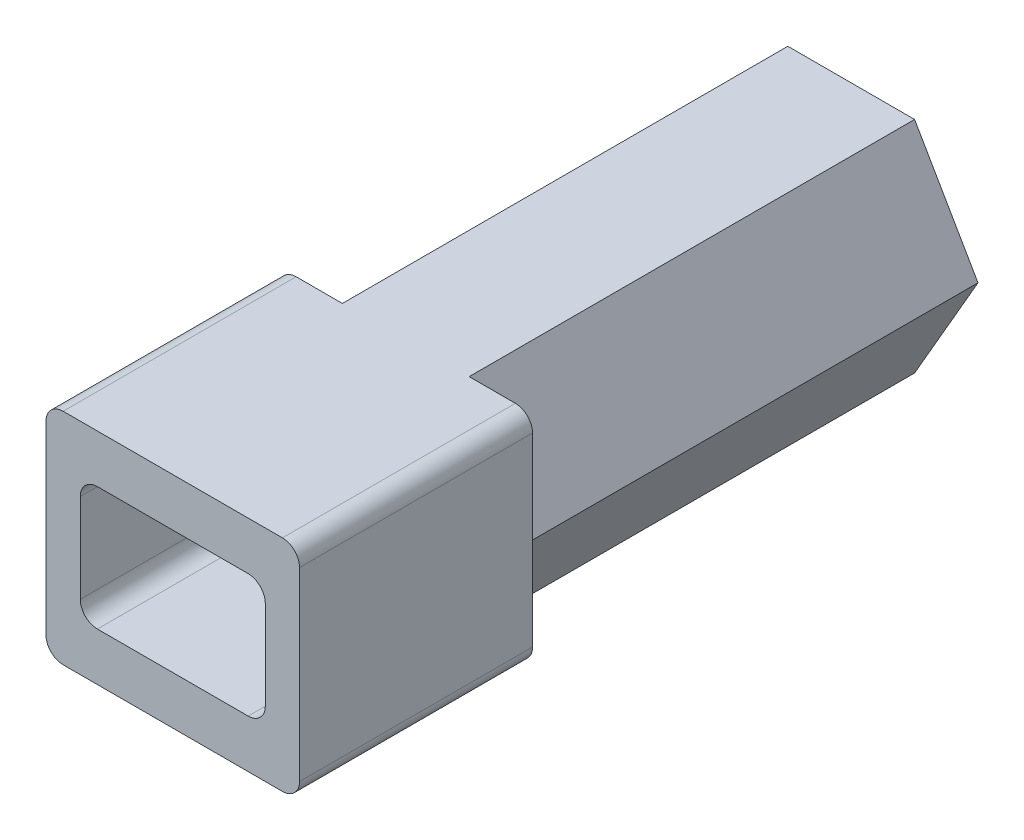
ISO-10303-21;
HEADER;
FILE_DESCRIPTION(('STEP AP214'),'2;1');
FILE_NAME('part.step','',(''),(''),'','','');
FILE_SCHEMA(('AUTOMOTIVE_DESIGN { 1 0 10303 214 1 1 1 1 }'));
ENDSEC;
DATA;
#1=APPLICATION_CONTEXT('core data for automotive mechanical design processes');
#2=APPLICATION_PROTOCOL_DEFINITION('international standard','automotive_design',2000,#1);
#3=PRODUCT_CONTEXT('',#1,'mechanical');
#4=PRODUCT('Part','Part','',(#3));
#5=PRODUCT_RELATED_PRODUCT_CATEGORY('part','',(#4));
#6=PRODUCT_DEFINITION_FORMATION('','',#4);
#7=PRODUCT_DEFINITION_CONTEXT('part definition',#1,'design');
#8=PRODUCT_DEFINITION('design','',#6,#7);
#9=PRODUCT_DEFINITION_SHAPE('','',#8);
#10=(LENGTH_UNIT() NAMED_UNIT(*) SI_UNIT(.MILLI.,.METRE.));
#11=(NAMED_UNIT(*) PLANE_ANGLE_UNIT() SI_UNIT($,.RADIAN.));
#12=(NAMED_UNIT(*) SI_UNIT($,.STERADIAN.) SOLID_ANGLE_UNIT());
#13=UNCERTAINTY_MEASURE_WITH_UNIT(LENGTH_MEASURE(1.E-05),#10,'distance_accuracy_value','');
#14=(GEOMETRIC_REPRESENTATION_CONTEXT(3) GLOBAL_UNCERTAINTY_ASSIGNED_CONTEXT((#13)) GLOBAL_UNIT_ASSIGNED_CONTEXT((#10,
#11,#12)) REPRESENTATION_CONTEXT('',''));
#15=CARTESIAN_POINT('',(0.,0.,0.));
#16=DIRECTION('',(0.,0.,1.));
#17=DIRECTION('',(1.,0.,0.));
#18=AXIS2_PLACEMENT_3D('',#15,#16,#17);
#19=CARTESIAN_POINT('',(1.85,-3.20429399400242,13.));
#20=DIRECTION('',(-0.866025403784439,0.5,0.));
#21=DIRECTION('',(-0.5,-0.866025403784439,0.));
#22=AXIS2_PLACEMENT_3D('',#19,#20,#21);
#23=PLANE('',#22);
#24=DIRECTION('',(0.5,0.866025403784439,0.));
#25=VECTOR('',#24,1.);
#26=CARTESIAN_POINT('',(1.85,-3.20429399400242,0.));
#27=LINE('',#26,#25);
#28=CARTESIAN_POINT('',(1.85,-3.20429399400242,0.));
#29=VERTEX_POINT('',#28);
#30=CARTESIAN_POINT('',(3.7,0.,0.));
#31=VERTEX_POINT('',#30);
#32=EDGE_CURVE('E186',#29,#31,#27,.T.);
#33=ORIENTED_EDGE('',*,*,#32,.T.);
#34=DIRECTION('',(0.,0.,-1.));
#35=VECTOR('',#34,1.);
#36=CARTESIAN_POINT('',(3.7,0.,13.));
#37=LINE('',#36,#35);
#38=CARTESIAN_POINT('',(3.7,0.,13.));
#39=VERTEX_POINT('',#38);
#40=EDGE_CURVE('E11',#39,#31,#37,.T.);
#41=ORIENTED_EDGE('',*,*,#40,.F.);
#42=DIRECTION('',(0.5,0.866025403784439,0.));
#43=VECTOR('',#42,1.);
#44=CARTESIAN_POINT('',(1.85,-3.20429399400242,13.));
#45=LINE('',#44,#43);
#46=CARTESIAN_POINT('',(1.85,-3.20429399400242,13.));
#47=VERTEX_POINT('',#46);
#48=EDGE_CURVE('E187',#47,#39,#45,.T.);
#49=ORIENTED_EDGE('',*,*,#48,.F.);
#50=DIRECTION('',(0.,0.,-1.));
#51=VECTOR('',#50,1.);
#52=CARTESIAN_POINT('',(1.85,-3.20429399400242,13.));
#53=LINE('',#52,#51);
#54=EDGE_CURVE('E68',#47,#29,#53,.T.);
#55=ORIENTED_EDGE('',*,*,#54,.T.);
#56=EDGE_LOOP('',(#33,#41,#49,#55));
#57=FACE_BOUND('',#56,.T.);
#58=ADVANCED_FACE('F43',(#57),#23,.F.);
#59=CARTESIAN_POINT('',(3.7,0.,13.));
#60=DIRECTION('',(-0.866025403784438,-0.5,0.));
#61=DIRECTION('',(0.5,-0.866025403784439,0.));
#62=AXIS2_PLACEMENT_3D('',#59,#60,#61);
#63=PLANE('',#62);
#64=DIRECTION('',(-0.5,0.866025403784438,0.));
#65=VECTOR('',#64,1.);
#66=CARTESIAN_POINT('',(3.7,0.,0.));
#67=LINE('',#66,#65);
#68=CARTESIAN_POINT('',(1.85,3.20429399400242,0.));
#69=VERTEX_POINT('',#68);
#70=EDGE_CURVE('E199',#31,#69,#67,.T.);
#71=ORIENTED_EDGE('',*,*,#70,.T.);
#72=DIRECTION('',(0.,0.,-1.));
#73=VECTOR('',#72,1.);
#74=CARTESIAN_POINT('',(1.85,3.20429399400242,13.));
#75=LINE('',#74,#73);
#76=CARTESIAN_POINT('',(1.85,3.20429399400242,13.));
#77=VERTEX_POINT('',#76);
#78=EDGE_CURVE('E52',#77,#69,#75,.T.);
#79=ORIENTED_EDGE('',*,*,#78,.F.);
#80=DIRECTION('',(-0.5,0.866025403784438,0.));
#81=VECTOR('',#80,1.);
#82=CARTESIAN_POINT('',(3.7,0.,13.));
#83=LINE('',#82,#81);
#84=EDGE_CURVE('E101',#39,#77,#83,.T.);
#85=ORIENTED_EDGE('',*,*,#84,.F.);
#86=ORIENTED_EDGE('',*,*,#40,.T.);
#87=EDGE_LOOP('',(#71,#79,#85,#86));
#88=FACE_BOUND('',#87,.T.);
#89=ADVANCED_FACE('F542',(#88),#63,.F.);
#90=CARTESIAN_POINT('',(1.85,3.20429399400242,13.));
#91=DIRECTION('',(0.,-1.,0.));
#92=DIRECTION('',(0.,0.,-1.));
#93=AXIS2_PLACEMENT_3D('',#90,#91,#92);
#94=PLANE('',#93);
#95=DIRECTION('',(-1.,0.,0.));
#96=VECTOR('',#95,1.);
#97=CARTESIAN_POINT('',(1.85,3.20429399400242,0.));
#98=LINE('',#97,#96);
#99=CARTESIAN_POINT('',(-1.85,3.20429399400242,0.));
#100=VERTEX_POINT('',#99);
#101=EDGE_CURVE('E120',#69,#100,#98,.T.);
#102=ORIENTED_EDGE('',*,*,#101,.T.);
#103=DIRECTION('',(0.,0.,-1.));
#104=VECTOR('',#103,1.);
#105=CARTESIAN_POINT('',(-1.85,3.20429399400242,13.));
#106=LINE('',#105,#104);
#107=CARTESIAN_POINT('',(-1.85,3.20429399400242,13.));
#108=VERTEX_POINT('',#107);
#109=EDGE_CURVE('E110',#108,#100,#106,.T.);
#110=ORIENTED_EDGE('',*,*,#109,.F.);
#111=DIRECTION('',(-1.,0.,0.));
#112=VECTOR('',#111,1.);
#113=CARTESIAN_POINT('',(1.85,3.20429399400242,13.));
#114=LINE('',#113,#112);
#115=CARTESIAN_POINT('',(-3.2,3.20429399400242,13.));
#116=VERTEX_POINT('',#115);
#117=EDGE_CURVE('E116',#108,#116,#114,.T.);
#118=ORIENTED_EDGE('',*,*,#117,.T.);
#119=DIRECTION('',(0.,0.,-1.));
#120=VECTOR('',#119,1.);
#121=CARTESIAN_POINT('',(-3.2,3.20429399400242,19.8));
#122=LINE('',#121,#120);
#123=CARTESIAN_POINT('',(-3.2,3.20429399400242,19.8));
#124=VERTEX_POINT('',#123);
#125=EDGE_CURVE('E183',#124,#116,#122,.T.);
#126=ORIENTED_EDGE('',*,*,#125,.F.);
#127=DIRECTION('',(-1.,0.,0.));
#128=VECTOR('',#127,1.);
#129=CARTESIAN_POINT('',(1.85,3.20429399400242,19.8));
#130=LINE('',#129,#128);
#131=CARTESIAN_POINT('',(3.19999999999999,3.20429399400242,19.8));
#132=VERTEX_POINT('',#131);
#133=EDGE_CURVE('E148',#132,#124,#130,.T.);
#134=ORIENTED_EDGE('',*,*,#133,.F.);
#135=DIRECTION('',(0.,0.,-1.));
#136=VECTOR('',#135,1.);
#137=CARTESIAN_POINT('',(3.19999999999999,3.20429399400242,19.8));
#138=LINE('',#137,#136);
#139=CARTESIAN_POINT('',(3.19999999999999,3.20429399400242,13.));
#140=VERTEX_POINT('',#139);
#141=EDGE_CURVE('E154',#132,#140,#138,.T.);
#142=ORIENTED_EDGE('',*,*,#141,.T.);
#143=EDGE_CURVE('E142',#140,#77,#114,.T.);
#144=ORIENTED_EDGE('',*,*,#143,.T.);
#145=ORIENTED_EDGE('',*,*,#78,.T.);
#146=EDGE_LOOP('',(#102,#110,#118,#126,#134,#142,#144,#145));
#147=FACE_BOUND('',#146,.T.);
#148=ADVANCED_FACE('F112',(#147),#94,.F.);
#149=CARTESIAN_POINT('',(-1.85,3.20429399400242,13.));
#150=DIRECTION('',(0.866025403784439,-0.5,0.));
#151=DIRECTION('',(0.5,0.866025403784439,0.));
#152=AXIS2_PLACEMENT_3D('',#149,#150,#151);
#153=PLANE('',#152);
#154=DIRECTION('',(-0.5,-0.866025403784439,0.));
#155=VECTOR('',#154,1.);
#156=CARTESIAN_POINT('',(-1.85,3.20429399400242,0.));
#157=LINE('',#156,#155);
#158=CARTESIAN_POINT('',(-3.7,0.,0.));
#159=VERTEX_POINT('',#158);
#160=EDGE_CURVE('E204',#100,#159,#157,.T.);
#161=ORIENTED_EDGE('',*,*,#160,.T.);
#162=DIRECTION('',(0.,0.,-1.));
#163=VECTOR('',#162,1.);
#164=CARTESIAN_POINT('',(-3.7,0.,13.));
#165=LINE('',#164,#163);
#166=CARTESIAN_POINT('',(-3.7,0.,13.));
#167=VERTEX_POINT('',#166);
#168=EDGE_CURVE('E124',#167,#159,#165,.T.);
#169=ORIENTED_EDGE('',*,*,#168,.F.);
#170=DIRECTION('',(-0.5,-0.866025403784439,0.));
#171=VECTOR('',#170,1.);
#172=CARTESIAN_POINT('',(-1.85,3.20429399400242,13.));
#173=LINE('',#172,#171);
#174=EDGE_CURVE('E127',#108,#167,#173,.T.);
#175=ORIENTED_EDGE('',*,*,#174,.F.);
#176=ORIENTED_EDGE('',*,*,#109,.T.);
#177=EDGE_LOOP('',(#161,#169,#175,#176));
#178=FACE_BOUND('',#177,.T.);
#179=ADVANCED_FACE('F128',(#178),#153,.F.);
#180=CARTESIAN_POINT('',(-3.7,0.,13.));
#181=DIRECTION('',(0.866025403784439,0.5,0.));
#182=DIRECTION('',(-0.5,0.866025403784439,0.));
#183=AXIS2_PLACEMENT_3D('',#180,#181,#182);
#184=PLANE('',#183);
#185=DIRECTION('',(0.5,-0.866025403784439,0.));
#186=VECTOR('',#185,1.);
#187=CARTESIAN_POINT('',(-3.7,0.,0.));
#188=LINE('',#187,#186);
#189=CARTESIAN_POINT('',(-1.85,-3.20429399400242,0.));
#190=VERTEX_POINT('',#189);
#191=EDGE_CURVE('E207',#159,#190,#188,.T.);
#192=ORIENTED_EDGE('',*,*,#191,.T.);
#193=DIRECTION('',(0.,0.,-1.));
#194=VECTOR('',#193,1.);
#195=CARTESIAN_POINT('',(-1.85,-3.20429399400242,13.));
#196=LINE('',#195,#194);
#197=CARTESIAN_POINT('',(-1.85,-3.20429399400243,13.));
#198=VERTEX_POINT('',#197);
#199=EDGE_CURVE('E214',#198,#190,#196,.T.);
#200=ORIENTED_EDGE('',*,*,#199,.F.);
#201=DIRECTION('',(0.5,-0.866025403784439,0.));
#202=VECTOR('',#201,1.);
#203=CARTESIAN_POINT('',(-3.7,0.,13.));
#204=LINE('',#203,#202);
#205=EDGE_CURVE('E135',#167,#198,#204,.T.);
#206=ORIENTED_EDGE('',*,*,#205,.F.);
#207=ORIENTED_EDGE('',*,*,#168,.T.);
#208=EDGE_LOOP('',(#192,#200,#206,#207));
#209=FACE_BOUND('',#208,.T.);
#210=ADVANCED_FACE('F226',(#209),#184,.F.);
#211=CARTESIAN_POINT('',(-1.85,-3.20429399400242,13.));
#212=DIRECTION('',(0.,1.,0.));
#213=DIRECTION('',(-1.,0.,0.));
#214=AXIS2_PLACEMENT_3D('',#211,#212,#213);
#215=PLANE('',#214);
#216=DIRECTION('',(1.,0.,0.));
#217=VECTOR('',#216,1.);
#218=CARTESIAN_POINT('',(-1.85,-3.20429399400242,0.));
#219=LINE('',#218,#217);
#220=EDGE_CURVE('E94',#190,#29,#219,.T.);
#221=ORIENTED_EDGE('',*,*,#220,.T.);
#222=ORIENTED_EDGE('',*,*,#54,.F.);
#223=DIRECTION('',(1.,0.,0.));
#224=VECTOR('',#223,1.);
#225=CARTESIAN_POINT('',(1.85,-3.20429399400242,13.));
#226=LINE('',#225,#224);
#227=CARTESIAN_POINT('',(3.19999999999999,-3.20429399400242,13.));
#228=VERTEX_POINT('',#227);
#229=EDGE_CURVE('E245',#47,#228,#226,.T.);
#230=ORIENTED_EDGE('',*,*,#229,.T.);
#231=DIRECTION('',(0.,0.,-1.));
#232=VECTOR('',#231,1.);
#233=CARTESIAN_POINT('',(3.19999999999999,-3.20429399400242,19.8));
#234=LINE('',#233,#232);
#235=CARTESIAN_POINT('',(3.19999999999999,-3.20429399400242,19.8));
#236=VERTEX_POINT('',#235);
#237=EDGE_CURVE('E167',#236,#228,#234,.T.);
#238=ORIENTED_EDGE('',*,*,#237,.F.);
#239=DIRECTION('',(1.,0.,0.));
#240=VECTOR('',#239,1.);
#241=CARTESIAN_POINT('',(-1.85,-3.20429399400242,19.8));
#242=LINE('',#241,#240);
#243=CARTESIAN_POINT('',(-3.2,-3.20429399400242,19.8));
#244=VERTEX_POINT('',#243);
#245=EDGE_CURVE('E323',#244,#236,#242,.T.);
#246=ORIENTED_EDGE('',*,*,#245,.F.);
#247=DIRECTION('',(0.,0.,-1.));
#248=VECTOR('',#247,1.);
#249=CARTESIAN_POINT('',(-3.2,-3.20429399400242,19.8));
#250=LINE('',#249,#248);
#251=CARTESIAN_POINT('',(-3.2,-3.20429399400242,13.));
#252=VERTEX_POINT('',#251);
#253=EDGE_CURVE('E171',#244,#252,#250,.T.);
#254=ORIENTED_EDGE('',*,*,#253,.T.);
#255=EDGE_CURVE('E234',#252,#198,#226,.T.);
#256=ORIENTED_EDGE('',*,*,#255,.T.);
#257=ORIENTED_EDGE('',*,*,#199,.T.);
#258=EDGE_LOOP('',(#221,#222,#230,#238,#246,#254,#256,#257));
#259=FACE_BOUND('',#258,.T.);
#260=ADVANCED_FACE('F240',(#259),#215,.F.);
#261=CARTESIAN_POINT('',(0.,0.,0.));
#262=DIRECTION('',(0.,0.,1.));
#263=DIRECTION('',(1.,0.,0.));
#264=AXIS2_PLACEMENT_3D('',#261,#262,#263);
#265=PLANE('',#264);
#266=CARTESIAN_POINT('',(0.,0.,0.));
#267=DIRECTION('',(0.,0.,-1.));
#268=DIRECTION('',(-1.,0.,0.));
#269=AXIS2_PLACEMENT_3D('',#266,#267,#268);
#270=CIRCLE('',#269,1.25);
#271=CARTESIAN_POINT('',(-1.25,0.,0.));
#272=VERTEX_POINT('',#271);
#273=EDGE_CURVE('E449',#272,#272,#270,.T.);
#274=ORIENTED_EDGE('',*,*,#273,.F.);
#275=EDGE_LOOP('',(#274));
#276=FACE_BOUND('',#275,.T.);
#277=ORIENTED_EDGE('',*,*,#32,.F.);
#278=ORIENTED_EDGE('',*,*,#220,.F.);
#279=ORIENTED_EDGE('',*,*,#191,.F.);
#280=ORIENTED_EDGE('',*,*,#160,.F.);
#281=ORIENTED_EDGE('',*,*,#101,.F.);
#282=ORIENTED_EDGE('',*,*,#70,.F.);
#283=EDGE_LOOP('',(#277,#278,#279,#280,#281,#282));
#284=FACE_BOUND('',#283,.T.);
#285=ADVANCED_FACE('F223',(#276,#284),#265,.F.);
#286=CARTESIAN_POINT('',(-3.2,2.70429399400242,13.));
#287=DIRECTION('',(0.,0.,1.));
#288=DIRECTION('',(1.,0.,0.));
#289=AXIS2_PLACEMENT_3D('',#286,#287,#288);
#290=PLANE('',#289);
#291=ORIENTED_EDGE('',*,*,#229,.F.);
#292=ORIENTED_EDGE('',*,*,#48,.T.);
#293=DIRECTION('',(0.,1.,0.));
#294=VECTOR('',#293,1.);
#295=CARTESIAN_POINT('',(3.7,2.32596645225261,13.));
#296=LINE('',#295,#294);
#297=CARTESIAN_POINT('',(3.7,-2.70429399400242,13.));
#298=VERTEX_POINT('',#297);
#299=EDGE_CURVE('E150',#298,#39,#296,.T.);
#300=ORIENTED_EDGE('',*,*,#299,.F.);
#301=CARTESIAN_POINT('',(3.2,-2.70429399400242,13.));
#302=DIRECTION('',(0.,0.,1.));
#303=DIRECTION('',(1.,0.,0.));
#304=AXIS2_PLACEMENT_3D('',#301,#302,#303);
#305=CIRCLE('',#304,0.5);
#306=EDGE_CURVE('E244',#228,#298,#305,.T.);
#307=ORIENTED_EDGE('',*,*,#306,.F.);
#308=EDGE_LOOP('',(#291,#292,#300,#307));
#309=FACE_BOUND('',#308,.T.);
#310=ADVANCED_FACE('F307',(#309),#290,.F.);
#311=CARTESIAN_POINT('',(3.7,2.70429399400242,13.));
#312=VERTEX_POINT('',#311);
#313=EDGE_CURVE('E250',#39,#312,#296,.T.);
#314=ORIENTED_EDGE('',*,*,#313,.F.);
#315=ORIENTED_EDGE('',*,*,#84,.T.);
#316=ORIENTED_EDGE('',*,*,#143,.F.);
#317=CARTESIAN_POINT('',(3.2,2.70429399400242,13.));
#318=DIRECTION('',(0.,0.,1.));
#319=DIRECTION('',(1.,0.,0.));
#320=AXIS2_PLACEMENT_3D('',#317,#318,#319);
#321=CIRCLE('',#320,0.5);
#322=EDGE_CURVE('E143',#312,#140,#321,.T.);
#323=ORIENTED_EDGE('',*,*,#322,.F.);
#324=EDGE_LOOP('',(#314,#315,#316,#323));
#325=FACE_BOUND('',#324,.T.);
#326=ADVANCED_FACE('F277',(#325),#290,.F.);
#327=ORIENTED_EDGE('',*,*,#117,.F.);
#328=ORIENTED_EDGE('',*,*,#174,.T.);
#329=DIRECTION('',(0.,-1.,0.));
#330=VECTOR('',#329,1.);
#331=CARTESIAN_POINT('',(-3.7,-2.70429399400242,13.));
#332=LINE('',#331,#330);
#333=CARTESIAN_POINT('',(-3.7,2.70429399400242,13.));
#334=VERTEX_POINT('',#333);
#335=EDGE_CURVE('E329',#334,#167,#332,.T.);
#336=ORIENTED_EDGE('',*,*,#335,.F.);
#337=CARTESIAN_POINT('',(-3.2,2.70429399400242,13.));
#338=DIRECTION('',(0.,0.,1.));
#339=DIRECTION('',(1.,0.,0.));
#340=AXIS2_PLACEMENT_3D('',#337,#338,#339);
#341=CIRCLE('',#340,0.5);
#342=EDGE_CURVE('E140',#116,#334,#341,.T.);
#343=ORIENTED_EDGE('',*,*,#342,.F.);
#344=EDGE_LOOP('',(#327,#328,#336,#343));
#345=FACE_BOUND('',#344,.T.);
#346=ADVANCED_FACE('F138',(#345),#290,.F.);
#347=CARTESIAN_POINT('',(-3.7,-2.70429399400242,13.));
#348=VERTEX_POINT('',#347);
#349=EDGE_CURVE('E237',#167,#348,#332,.T.);
#350=ORIENTED_EDGE('',*,*,#349,.F.);
#351=ORIENTED_EDGE('',*,*,#205,.T.);
#352=ORIENTED_EDGE('',*,*,#255,.F.);
#353=CARTESIAN_POINT('',(-3.2,-2.70429399400242,13.));
#354=DIRECTION('',(0.,0.,1.));
#355=DIRECTION('',(-1.,0.,0.));
#356=AXIS2_PLACEMENT_3D('',#353,#354,#355);
#357=CIRCLE('',#356,0.5);
#358=EDGE_CURVE('E252',#348,#252,#357,.T.);
#359=ORIENTED_EDGE('',*,*,#358,.F.);
#360=EDGE_LOOP('',(#350,#351,#352,#359));
#361=FACE_BOUND('',#360,.T.);
#362=ADVANCED_FACE('F231',(#361),#290,.F.);
#363=CARTESIAN_POINT('',(-3.2,2.70429399400242,19.8));
#364=DIRECTION('',(0.,0.,1.));
#365=DIRECTION('',(1.,0.,0.));
#366=AXIS2_PLACEMENT_3D('',#363,#364,#365);
#367=PLANE('',#366);
#368=ORIENTED_EDGE('',*,*,#133,.T.);
#369=CARTESIAN_POINT('',(-3.2,2.70429399400242,19.8));
#370=DIRECTION('',(0.,0.,1.));
#371=DIRECTION('',(1.,0.,0.));
#372=AXIS2_PLACEMENT_3D('',#369,#370,#371);
#373=CIRCLE('',#372,0.5);
#374=CARTESIAN_POINT('',(-3.7,2.70429399400242,19.8));
#375=VERTEX_POINT('',#374);
#376=EDGE_CURVE('E352',#124,#375,#373,.T.);
#377=ORIENTED_EDGE('',*,*,#376,.T.);
#378=DIRECTION('',(0.,-1.,0.));
#379=VECTOR('',#378,1.);
#380=CARTESIAN_POINT('',(-3.7,2.70429399400242,19.8));
#381=LINE('',#380,#379);
#382=CARTESIAN_POINT('',(-3.7,-2.70429399400242,19.8));
#383=VERTEX_POINT('',#382);
#384=EDGE_CURVE('E348',#375,#383,#381,.T.);
#385=ORIENTED_EDGE('',*,*,#384,.T.);
#386=CARTESIAN_POINT('',(-3.2,-2.70429399400242,19.8));
#387=DIRECTION('',(0.,0.,1.));
#388=DIRECTION('',(-1.,0.,0.));
#389=AXIS2_PLACEMENT_3D('',#386,#387,#388);
#390=CIRCLE('',#389,0.5);
#391=EDGE_CURVE('E342',#383,#244,#390,.T.);
#392=ORIENTED_EDGE('',*,*,#391,.T.);
#393=ORIENTED_EDGE('',*,*,#245,.T.);
#394=CARTESIAN_POINT('',(3.2,-2.70429399400242,19.8));
#395=DIRECTION('',(0.,0.,1.));
#396=DIRECTION('',(1.,0.,0.));
#397=AXIS2_PLACEMENT_3D('',#394,#395,#396);
#398=CIRCLE('',#397,0.5);
#399=CARTESIAN_POINT('',(3.7,-2.70429399400242,19.8));
#400=VERTEX_POINT('',#399);
#401=EDGE_CURVE('E318',#236,#400,#398,.T.);
#402=ORIENTED_EDGE('',*,*,#401,.T.);
#403=DIRECTION('',(0.,1.,0.));
#404=VECTOR('',#403,1.);
#405=CARTESIAN_POINT('',(3.7,-2.70429399400242,19.8));
#406=LINE('',#405,#404);
#407=CARTESIAN_POINT('',(3.7,2.70429399400242,19.8));
#408=VERTEX_POINT('',#407);
#409=EDGE_CURVE('E313',#400,#408,#406,.T.);
#410=ORIENTED_EDGE('',*,*,#409,.T.);
#411=CARTESIAN_POINT('',(3.2,2.70429399400242,19.8));
#412=DIRECTION('',(0.,0.,1.));
#413=DIRECTION('',(1.,0.,0.));
#414=AXIS2_PLACEMENT_3D('',#411,#412,#413);
#415=CIRCLE('',#414,0.5);
#416=EDGE_CURVE('E159',#408,#132,#415,.T.);
#417=ORIENTED_EDGE('',*,*,#416,.T.);
#418=EDGE_LOOP('',(#368,#377,#385,#392,#393,#402,#410,#417));
#419=FACE_BOUND('',#418,.T.);
#420=DIRECTION('',(-1.,0.,0.));
#421=VECTOR('',#420,1.);
#422=CARTESIAN_POINT('',(-2.2,1.8,19.8));
#423=LINE('',#422,#421);
#424=CARTESIAN_POINT('',(2.2,1.8,19.8));
#425=VERTEX_POINT('',#424);
#426=CARTESIAN_POINT('',(-2.2,1.8,19.8));
#427=VERTEX_POINT('',#426);
#428=EDGE_CURVE('E442',#425,#427,#423,.T.);
#429=ORIENTED_EDGE('',*,*,#428,.F.);
#430=CARTESIAN_POINT('',(2.2,1.3,19.8));
#431=DIRECTION('',(0.,0.,1.));
#432=DIRECTION('',(-1.,0.,0.));
#433=AXIS2_PLACEMENT_3D('',#430,#431,#432);
#434=CIRCLE('',#433,0.5);
#435=CARTESIAN_POINT('',(2.7,1.3,19.8));
#436=VERTEX_POINT('',#435);
#437=EDGE_CURVE('E392',#436,#425,#434,.T.);
#438=ORIENTED_EDGE('',*,*,#437,.F.);
#439=DIRECTION('',(0.,1.,0.));
#440=VECTOR('',#439,1.);
#441=CARTESIAN_POINT('',(2.7,-1.3,19.8));
#442=LINE('',#441,#440);
#443=CARTESIAN_POINT('',(2.7,-1.3,19.8));
#444=VERTEX_POINT('',#443);
#445=EDGE_CURVE('E387',#444,#436,#442,.T.);
#446=ORIENTED_EDGE('',*,*,#445,.F.);
#447=CARTESIAN_POINT('',(2.2,-1.3,19.8));
#448=DIRECTION('',(0.,0.,1.));
#449=DIRECTION('',(1.,0.,0.));
#450=AXIS2_PLACEMENT_3D('',#447,#448,#449);
#451=CIRCLE('',#450,0.5);
#452=CARTESIAN_POINT('',(2.2,-1.8,19.8));
#453=VERTEX_POINT('',#452);
#454=EDGE_CURVE('E423',#453,#444,#451,.T.);
#455=ORIENTED_EDGE('',*,*,#454,.F.);
#456=DIRECTION('',(1.,0.,0.));
#457=VECTOR('',#456,1.);
#458=CARTESIAN_POINT('',(-2.2,-1.8,19.8));
#459=LINE('',#458,#457);
#460=CARTESIAN_POINT('',(-2.2,-1.8,19.8));
#461=VERTEX_POINT('',#460);
#462=EDGE_CURVE('E426',#461,#453,#459,.T.);
#463=ORIENTED_EDGE('',*,*,#462,.F.);
#464=CARTESIAN_POINT('',(-2.2,-1.3,19.8));
#465=DIRECTION('',(0.,0.,1.));
#466=DIRECTION('',(-1.,0.,0.));
#467=AXIS2_PLACEMENT_3D('',#464,#465,#466);
#468=CIRCLE('',#467,0.5);
#469=CARTESIAN_POINT('',(-2.7,-1.3,19.8));
#470=VERTEX_POINT('',#469);
#471=EDGE_CURVE('E430',#470,#461,#468,.T.);
#472=ORIENTED_EDGE('',*,*,#471,.F.);
#473=DIRECTION('',(0.,-1.,0.));
#474=VECTOR('',#473,1.);
#475=CARTESIAN_POINT('',(-2.7,-1.3,19.8));
#476=LINE('',#475,#474);
#477=CARTESIAN_POINT('',(-2.7,1.3,19.8));
#478=VERTEX_POINT('',#477);
#479=EDGE_CURVE('E434',#478,#470,#476,.T.);
#480=ORIENTED_EDGE('',*,*,#479,.F.);
#481=CARTESIAN_POINT('',(-2.2,1.3,19.8));
#482=DIRECTION('',(0.,0.,1.));
#483=DIRECTION('',(-1.,0.,0.));
#484=AXIS2_PLACEMENT_3D('',#481,#482,#483);
#485=CIRCLE('',#484,0.5);
#486=EDGE_CURVE('E438',#427,#478,#485,.T.);
#487=ORIENTED_EDGE('',*,*,#486,.F.);
#488=EDGE_LOOP('',(#429,#438,#446,#455,#463,#472,#480,#487));
#489=FACE_BOUND('',#488,.T.);
#490=ADVANCED_FACE('F480',(#419,#489),#367,.T.);
#491=CARTESIAN_POINT('',(-3.2,2.70429399400242,19.8));
#492=DIRECTION('',(0.,0.,-1.));
#493=DIRECTION('',(-1.,0.,0.));
#494=AXIS2_PLACEMENT_3D('',#491,#492,#493);
#495=CYLINDRICAL_SURFACE('',#494,0.5);
#496=ORIENTED_EDGE('',*,*,#342,.T.);
#497=DIRECTION('',(0.,0.,-1.));
#498=VECTOR('',#497,1.);
#499=CARTESIAN_POINT('',(-3.7,2.70429399400242,19.8));
#500=LINE('',#499,#498);
#501=EDGE_CURVE('E179',#375,#334,#500,.T.);
#502=ORIENTED_EDGE('',*,*,#501,.F.);
#503=ORIENTED_EDGE('',*,*,#376,.F.);
#504=ORIENTED_EDGE('',*,*,#125,.T.);
#505=EDGE_LOOP('',(#496,#502,#503,#504));
#506=FACE_BOUND('',#505,.T.);
#507=ADVANCED_FACE('F483',(#506),#495,.T.);
#508=CARTESIAN_POINT('',(-3.7,-2.70429399400242,19.8));
#509=DIRECTION('',(1.,0.,0.));
#510=DIRECTION('',(0.,0.,-1.));
#511=AXIS2_PLACEMENT_3D('',#508,#509,#510);
#512=PLANE('',#511);
#513=ORIENTED_EDGE('',*,*,#335,.T.);
#514=ORIENTED_EDGE('',*,*,#349,.T.);
#515=DIRECTION('',(0.,0.,-1.));
#516=VECTOR('',#515,1.);
#517=CARTESIAN_POINT('',(-3.7,-2.70429399400242,19.8));
#518=LINE('',#517,#516);
#519=EDGE_CURVE('E175',#383,#348,#518,.T.);
#520=ORIENTED_EDGE('',*,*,#519,.F.);
#521=ORIENTED_EDGE('',*,*,#384,.F.);
#522=ORIENTED_EDGE('',*,*,#501,.T.);
#523=EDGE_LOOP('',(#513,#514,#520,#521,#522));
#524=FACE_BOUND('',#523,.T.);
#525=ADVANCED_FACE('F335',(#524),#512,.F.);
#526=CARTESIAN_POINT('',(-3.2,-2.70429399400242,19.8));
#527=DIRECTION('',(0.,0.,-1.));
#528=DIRECTION('',(-1.,0.,0.));
#529=AXIS2_PLACEMENT_3D('',#526,#527,#528);
#530=CYLINDRICAL_SURFACE('',#529,0.5);
#531=ORIENTED_EDGE('',*,*,#358,.T.);
#532=ORIENTED_EDGE('',*,*,#253,.F.);
#533=ORIENTED_EDGE('',*,*,#391,.F.);
#534=ORIENTED_EDGE('',*,*,#519,.T.);
#535=EDGE_LOOP('',(#531,#532,#533,#534));
#536=FACE_BOUND('',#535,.T.);
#537=ADVANCED_FACE('F340',(#536),#530,.T.);
#538=CARTESIAN_POINT('',(3.2,-2.70429399400242,19.8));
#539=DIRECTION('',(0.,0.,-1.));
#540=DIRECTION('',(-1.,0.,0.));
#541=AXIS2_PLACEMENT_3D('',#538,#539,#540);
#542=CYLINDRICAL_SURFACE('',#541,0.5);
#543=ORIENTED_EDGE('',*,*,#306,.T.);
#544=DIRECTION('',(0.,0.,-1.));
#545=VECTOR('',#544,1.);
#546=CARTESIAN_POINT('',(3.7,-2.70429399400242,19.8));
#547=LINE('',#546,#545);
#548=EDGE_CURVE('E163',#400,#298,#547,.T.);
#549=ORIENTED_EDGE('',*,*,#548,.F.);
#550=ORIENTED_EDGE('',*,*,#401,.F.);
#551=ORIENTED_EDGE('',*,*,#237,.T.);
#552=EDGE_LOOP('',(#543,#549,#550,#551));
#553=FACE_BOUND('',#552,.T.);
#554=ADVANCED_FACE('F310',(#553),#542,.T.);
#555=CARTESIAN_POINT('',(3.7,2.32596645225261,19.8));
#556=DIRECTION('',(-1.,0.,0.));
#557=DIRECTION('',(0.,0.,1.));
#558=AXIS2_PLACEMENT_3D('',#555,#556,#557);
#559=PLANE('',#558);
#560=ORIENTED_EDGE('',*,*,#299,.T.);
#561=ORIENTED_EDGE('',*,*,#313,.T.);
#562=DIRECTION('',(0.,0.,-1.));
#563=VECTOR('',#562,1.);
#564=CARTESIAN_POINT('',(3.7,2.70429399400242,19.8));
#565=LINE('',#564,#563);
#566=EDGE_CURVE('E158',#408,#312,#565,.T.);
#567=ORIENTED_EDGE('',*,*,#566,.F.);
#568=ORIENTED_EDGE('',*,*,#409,.F.);
#569=ORIENTED_EDGE('',*,*,#548,.T.);
#570=EDGE_LOOP('',(#560,#561,#567,#568,#569));
#571=FACE_BOUND('',#570,.T.);
#572=ADVANCED_FACE('F264',(#571),#559,.F.);
#573=CARTESIAN_POINT('',(3.2,2.70429399400242,19.8));
#574=DIRECTION('',(0.,0.,-1.));
#575=DIRECTION('',(-1.,0.,0.));
#576=AXIS2_PLACEMENT_3D('',#573,#574,#575);
#577=CYLINDRICAL_SURFACE('',#576,0.5);
#578=ORIENTED_EDGE('',*,*,#322,.T.);
#579=ORIENTED_EDGE('',*,*,#141,.F.);
#580=ORIENTED_EDGE('',*,*,#416,.F.);
#581=ORIENTED_EDGE('',*,*,#566,.T.);
#582=EDGE_LOOP('',(#578,#579,#580,#581));
#583=FACE_BOUND('',#582,.T.);
#584=ADVANCED_FACE('F274',(#583),#577,.T.);
#585=CARTESIAN_POINT('',(2.2,1.3,19.8));
#586=DIRECTION('',(0.,0.,-1.));
#587=DIRECTION('',(-1.,0.,0.));
#588=AXIS2_PLACEMENT_3D('',#585,#586,#587);
#589=CYLINDRICAL_SURFACE('',#588,0.5);
#590=CARTESIAN_POINT('',(2.2,1.3,13.));
#591=DIRECTION('',(0.,0.,1.));
#592=DIRECTION('',(-1.,0.,0.));
#593=AXIS2_PLACEMENT_3D('',#590,#591,#592);
#594=CIRCLE('',#593,0.5);
#595=CARTESIAN_POINT('',(2.7,1.3,13.));
#596=VERTEX_POINT('',#595);
#597=CARTESIAN_POINT('',(2.2,1.8,13.));
#598=VERTEX_POINT('',#597);
#599=EDGE_CURVE('E417',#596,#598,#594,.T.);
#600=ORIENTED_EDGE('',*,*,#599,.F.);
#601=DIRECTION('',(0.,0.,-1.));
#602=VECTOR('',#601,1.);
#603=CARTESIAN_POINT('',(2.7,1.3,19.8));
#604=LINE('',#603,#602);
#605=EDGE_CURVE('E59',#436,#596,#604,.T.);
#606=ORIENTED_EDGE('',*,*,#605,.F.);
#607=ORIENTED_EDGE('',*,*,#437,.T.);
#608=DIRECTION('',(0.,0.,-1.));
#609=VECTOR('',#608,1.);
#610=CARTESIAN_POINT('',(2.2,1.8,19.8));
#611=LINE('',#610,#609);
#612=EDGE_CURVE('E328',#425,#598,#611,.T.);
#613=ORIENTED_EDGE('',*,*,#612,.T.);
#614=EDGE_LOOP('',(#600,#606,#607,#613));
#615=FACE_BOUND('',#614,.T.);
#616=ADVANCED_FACE('F507',(#615),#589,.F.);
#617=CARTESIAN_POINT('',(-2.2,1.8,19.8));
#618=DIRECTION('',(0.,-1.,0.));
#619=DIRECTION('',(0.,0.,-1.));
#620=AXIS2_PLACEMENT_3D('',#617,#618,#619);
#621=PLANE('',#620);
#622=DIRECTION('',(-1.,0.,0.));
#623=VECTOR('',#622,1.);
#624=CARTESIAN_POINT('',(-2.2,1.8,13.));
#625=LINE('',#624,#623);
#626=CARTESIAN_POINT('',(-2.2,1.8,13.));
#627=VERTEX_POINT('',#626);
#628=EDGE_CURVE('E413',#598,#627,#625,.T.);
#629=ORIENTED_EDGE('',*,*,#628,.F.);
#630=ORIENTED_EDGE('',*,*,#612,.F.);
#631=ORIENTED_EDGE('',*,*,#428,.T.);
#632=DIRECTION('',(0.,0.,-1.));
#633=VECTOR('',#632,1.);
#634=CARTESIAN_POINT('',(-2.2,1.8,19.8));
#635=LINE('',#634,#633);
#636=EDGE_CURVE('E363',#427,#627,#635,.T.);
#637=ORIENTED_EDGE('',*,*,#636,.T.);
#638=EDGE_LOOP('',(#629,#630,#631,#637));
#639=FACE_BOUND('',#638,.T.);
#640=ADVANCED_FACE('F494',(#639),#621,.T.);
#641=CARTESIAN_POINT('',(-2.2,1.3,19.8));
#642=DIRECTION('',(0.,0.,-1.));
#643=DIRECTION('',(-1.,0.,0.));
#644=AXIS2_PLACEMENT_3D('',#641,#642,#643);
#645=CYLINDRICAL_SURFACE('',#644,0.5);
#646=CARTESIAN_POINT('',(-2.2,1.3,13.));
#647=DIRECTION('',(0.,0.,1.));
#648=DIRECTION('',(-1.,0.,0.));
#649=AXIS2_PLACEMENT_3D('',#646,#647,#648);
#650=CIRCLE('',#649,0.5);
#651=CARTESIAN_POINT('',(-2.7,1.3,13.));
#652=VERTEX_POINT('',#651);
#653=EDGE_CURVE('E409',#627,#652,#650,.T.);
#654=ORIENTED_EDGE('',*,*,#653,.F.);
#655=ORIENTED_EDGE('',*,*,#636,.F.);
#656=ORIENTED_EDGE('',*,*,#486,.T.);
#657=DIRECTION('',(0.,0.,-1.));
#658=VECTOR('',#657,1.);
#659=CARTESIAN_POINT('',(-2.7,1.3,19.8));
#660=LINE('',#659,#658);
#661=EDGE_CURVE('E367',#478,#652,#660,.T.);
#662=ORIENTED_EDGE('',*,*,#661,.T.);
#663=EDGE_LOOP('',(#654,#655,#656,#662));
#664=FACE_BOUND('',#663,.T.);
#665=ADVANCED_FACE('F500',(#664),#645,.F.);
#666=CARTESIAN_POINT('',(-2.7,-1.3,19.8));
#667=DIRECTION('',(1.,0.,0.));
#668=DIRECTION('',(0.,0.,-1.));
#669=AXIS2_PLACEMENT_3D('',#666,#667,#668);
#670=PLANE('',#669);
#671=DIRECTION('',(0.,-1.,0.));
#672=VECTOR('',#671,1.);
#673=CARTESIAN_POINT('',(-2.7,-1.3,13.));
#674=LINE('',#673,#672);
#675=CARTESIAN_POINT('',(-2.7,-1.3,13.));
#676=VERTEX_POINT('',#675);
#677=EDGE_CURVE('E405',#652,#676,#674,.T.);
#678=ORIENTED_EDGE('',*,*,#677,.F.);
#679=ORIENTED_EDGE('',*,*,#661,.F.);
#680=ORIENTED_EDGE('',*,*,#479,.T.);
#681=DIRECTION('',(0.,0.,-1.));
#682=VECTOR('',#681,1.);
#683=CARTESIAN_POINT('',(-2.7,-1.3,19.8));
#684=LINE('',#683,#682);
#685=EDGE_CURVE('E371',#470,#676,#684,.T.);
#686=ORIENTED_EDGE('',*,*,#685,.T.);
#687=EDGE_LOOP('',(#678,#679,#680,#686));
#688=FACE_BOUND('',#687,.T.);
#689=ADVANCED_FACE('F528',(#688),#670,.T.);
#690=CARTESIAN_POINT('',(-2.2,-1.3,19.8));
#691=DIRECTION('',(0.,0.,-1.));
#692=DIRECTION('',(-1.,0.,0.));
#693=AXIS2_PLACEMENT_3D('',#690,#691,#692);
#694=CYLINDRICAL_SURFACE('',#693,0.5);
#695=CARTESIAN_POINT('',(-2.2,-1.3,13.));
#696=DIRECTION('',(0.,0.,1.));
#697=DIRECTION('',(-1.,0.,0.));
#698=AXIS2_PLACEMENT_3D('',#695,#696,#697);
#699=CIRCLE('',#698,0.5);
#700=CARTESIAN_POINT('',(-2.2,-1.8,13.));
#701=VERTEX_POINT('',#700);
#702=EDGE_CURVE('E401',#676,#701,#699,.T.);
#703=ORIENTED_EDGE('',*,*,#702,.F.);
#704=ORIENTED_EDGE('',*,*,#685,.F.);
#705=ORIENTED_EDGE('',*,*,#471,.T.);
#706=DIRECTION('',(0.,0.,-1.));
#707=VECTOR('',#706,1.);
#708=CARTESIAN_POINT('',(-2.2,-1.8,19.8));
#709=LINE('',#708,#707);
#710=EDGE_CURVE('E375',#461,#701,#709,.T.);
#711=ORIENTED_EDGE('',*,*,#710,.T.);
#712=EDGE_LOOP('',(#703,#704,#705,#711));
#713=FACE_BOUND('',#712,.T.);
#714=ADVANCED_FACE('F520',(#713),#694,.F.);
#715=CARTESIAN_POINT('',(-2.2,-1.8,19.8));
#716=DIRECTION('',(0.,1.,0.));
#717=DIRECTION('',(0.,0.,1.));
#718=AXIS2_PLACEMENT_3D('',#715,#716,#717);
#719=PLANE('',#718);
#720=DIRECTION('',(1.,0.,0.));
#721=VECTOR('',#720,1.);
#722=CARTESIAN_POINT('',(-2.2,-1.8,13.));
#723=LINE('',#722,#721);
#724=CARTESIAN_POINT('',(2.2,-1.8,13.));
#725=VERTEX_POINT('',#724);
#726=EDGE_CURVE('E397',#701,#725,#723,.T.);
#727=ORIENTED_EDGE('',*,*,#726,.F.);
#728=ORIENTED_EDGE('',*,*,#710,.F.);
#729=ORIENTED_EDGE('',*,*,#462,.T.);
#730=DIRECTION('',(0.,0.,-1.));
#731=VECTOR('',#730,1.);
#732=CARTESIAN_POINT('',(2.2,-1.8,19.8));
#733=LINE('',#732,#731);
#734=EDGE_CURVE('E379',#453,#725,#733,.T.);
#735=ORIENTED_EDGE('',*,*,#734,.T.);
#736=EDGE_LOOP('',(#727,#728,#729,#735));
#737=FACE_BOUND('',#736,.T.);
#738=ADVANCED_FACE('F525',(#737),#719,.T.);
#739=CARTESIAN_POINT('',(2.2,-1.3,19.8));
#740=DIRECTION('',(0.,0.,-1.));
#741=DIRECTION('',(-1.,0.,0.));
#742=AXIS2_PLACEMENT_3D('',#739,#740,#741);
#743=CYLINDRICAL_SURFACE('',#742,0.5);
#744=CARTESIAN_POINT('',(2.2,-1.3,13.));
#745=DIRECTION('',(0.,0.,1.));
#746=DIRECTION('',(1.,0.,0.));
#747=AXIS2_PLACEMENT_3D('',#744,#745,#746);
#748=CIRCLE('',#747,0.5);
#749=CARTESIAN_POINT('',(2.7,-1.3,13.));
#750=VERTEX_POINT('',#749);
#751=EDGE_CURVE('E393',#725,#750,#748,.T.);
#752=ORIENTED_EDGE('',*,*,#751,.F.);
#753=ORIENTED_EDGE('',*,*,#734,.F.);
#754=ORIENTED_EDGE('',*,*,#454,.T.);
#755=DIRECTION('',(0.,0.,-1.));
#756=VECTOR('',#755,1.);
#757=CARTESIAN_POINT('',(2.7,-1.3,19.8));
#758=LINE('',#757,#756);
#759=EDGE_CURVE('E287',#444,#750,#758,.T.);
#760=ORIENTED_EDGE('',*,*,#759,.T.);
#761=EDGE_LOOP('',(#752,#753,#754,#760));
#762=FACE_BOUND('',#761,.T.);
#763=ADVANCED_FACE('F532',(#762),#743,.F.);
#764=CARTESIAN_POINT('',(2.7,-1.3,19.8));
#765=DIRECTION('',(-1.,0.,0.));
#766=DIRECTION('',(0.,-1.,0.));
#767=AXIS2_PLACEMENT_3D('',#764,#765,#766);
#768=PLANE('',#767);
#769=DIRECTION('',(0.,1.,0.));
#770=VECTOR('',#769,1.);
#771=CARTESIAN_POINT('',(2.7,-1.3,13.));
#772=LINE('',#771,#770);
#773=EDGE_CURVE('E388',#750,#596,#772,.T.);
#774=ORIENTED_EDGE('',*,*,#773,.F.);
#775=ORIENTED_EDGE('',*,*,#759,.F.);
#776=ORIENTED_EDGE('',*,*,#445,.T.);
#777=ORIENTED_EDGE('',*,*,#605,.T.);
#778=EDGE_LOOP('',(#774,#775,#776,#777));
#779=FACE_BOUND('',#778,.T.);
#780=ADVANCED_FACE('F463',(#779),#768,.T.);
#781=CARTESIAN_POINT('',(0.,0.,13.));
#782=DIRECTION('',(0.,0.,1.));
#783=DIRECTION('',(1.,0.,0.));
#784=AXIS2_PLACEMENT_3D('',#781,#782,#783);
#785=PLANE('',#784);
#786=CARTESIAN_POINT('',(0.,0.,13.));
#787=DIRECTION('',(0.,0.,1.));
#788=DIRECTION('',(1.,0.,0.));
#789=AXIS2_PLACEMENT_3D('',#786,#787,#788);
#790=CIRCLE('',#789,1.25);
#791=CARTESIAN_POINT('',(1.25,0.,13.));
#792=VERTEX_POINT('',#791);
#793=EDGE_CURVE('E46',#792,#792,#790,.T.);
#794=ORIENTED_EDGE('',*,*,#793,.F.);
#795=EDGE_LOOP('',(#794));
#796=FACE_BOUND('',#795,.T.);
#797=ORIENTED_EDGE('',*,*,#773,.T.);
#798=ORIENTED_EDGE('',*,*,#599,.T.);
#799=ORIENTED_EDGE('',*,*,#628,.T.);
#800=ORIENTED_EDGE('',*,*,#653,.T.);
#801=ORIENTED_EDGE('',*,*,#677,.T.);
#802=ORIENTED_EDGE('',*,*,#702,.T.);
#803=ORIENTED_EDGE('',*,*,#726,.T.);
#804=ORIENTED_EDGE('',*,*,#751,.T.);
#805=EDGE_LOOP('',(#797,#798,#799,#800,#801,#802,#803,#804));
#806=FACE_BOUND('',#805,.T.);
#807=ADVANCED_FACE('F460',(#796,#806),#785,.T.);
#808=CARTESIAN_POINT('',(0.,0.,13.8));
#809=DIRECTION('',(0.,0.,-1.));
#810=DIRECTION('',(-1.,0.,0.));
#811=AXIS2_PLACEMENT_3D('',#808,#809,#810);
#812=CYLINDRICAL_SURFACE('',#811,1.25);
#813=ORIENTED_EDGE('',*,*,#793,.T.);
#814=EDGE_LOOP('',(#813));
#815=FACE_BOUND('',#814,.T.);
#816=ORIENTED_EDGE('',*,*,#273,.T.);
#817=EDGE_LOOP('',(#816));
#818=FACE_BOUND('',#817,.T.);
#819=ADVANCED_FACE('F458',(#815,#818),#812,.F.);
#820=CLOSED_SHELL('',(#58,#89,#148,#179,#210,#260,#285,#310,#326,#346,#362,#490,#507,#525,#537,
#554,#572,#584,#616,#640,#665,#689,#714,#738,#763,#780,#807,#819));
#821=MANIFOLD_SOLID_BREP('B2',#820);
#822=ADVANCED_BREP_SHAPE_REPRESENTATION('',(#18,#821),#14);
#823=SHAPE_DEFINITION_REPRESENTATION(#9,#822);
ENDSEC;
END-ISO-10303-21;
